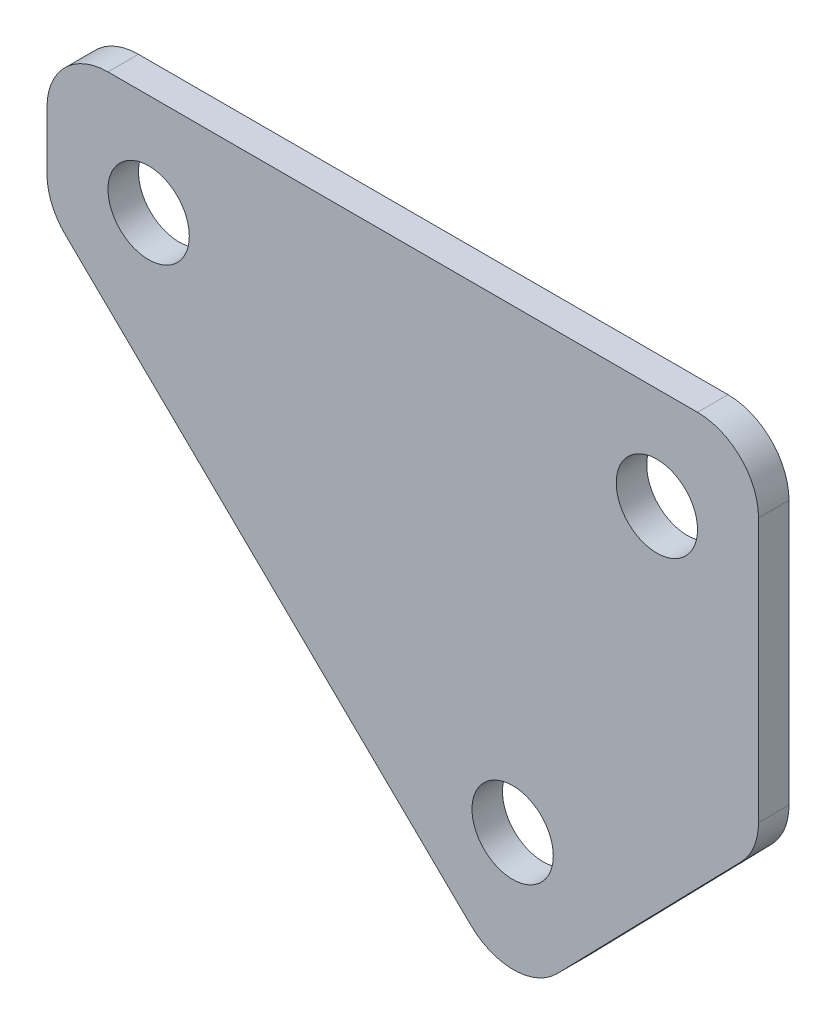
ISO-10303-21;
HEADER;
FILE_DESCRIPTION(('STEP AP214'),'2;1');
FILE_NAME('part.step','',(''),(''),'','','');
FILE_SCHEMA(('AUTOMOTIVE_DESIGN { 1 0 10303 214 1 1 1 1 }'));
ENDSEC;
DATA;
#1=APPLICATION_CONTEXT('core data for automotive mechanical design processes');
#2=APPLICATION_PROTOCOL_DEFINITION('international standard','automotive_design',2000,#1);
#3=PRODUCT_CONTEXT('',#1,'mechanical');
#4=PRODUCT('Part','Part','',(#3));
#5=PRODUCT_RELATED_PRODUCT_CATEGORY('part','',(#4));
#6=PRODUCT_DEFINITION_FORMATION('','',#4);
#7=PRODUCT_DEFINITION_CONTEXT('part definition',#1,'design');
#8=PRODUCT_DEFINITION('design','',#6,#7);
#9=PRODUCT_DEFINITION_SHAPE('','',#8);
#10=(LENGTH_UNIT() NAMED_UNIT(*) SI_UNIT(.MILLI.,.METRE.));
#11=(NAMED_UNIT(*) PLANE_ANGLE_UNIT() SI_UNIT($,.RADIAN.));
#12=(NAMED_UNIT(*) SI_UNIT($,.STERADIAN.) SOLID_ANGLE_UNIT());
#13=UNCERTAINTY_MEASURE_WITH_UNIT(LENGTH_MEASURE(1.E-05),#10,'distance_accuracy_value','');
#14=(GEOMETRIC_REPRESENTATION_CONTEXT(3) GLOBAL_UNCERTAINTY_ASSIGNED_CONTEXT((#13)) GLOBAL_UNIT_ASSIGNED_CONTEXT((#10,
#11,#12)) REPRESENTATION_CONTEXT('',''));
#15=CARTESIAN_POINT('',(0.,0.,0.));
#16=DIRECTION('',(0.,0.,1.));
#17=DIRECTION('',(1.,0.,0.));
#18=AXIS2_PLACEMENT_3D('',#15,#16,#17);
#19=CARTESIAN_POINT('',(-4.70018897091451,-4.82319446412929,1.5));
#20=DIRECTION('',(0.697915467486602,0.716180145105237,0.));
#21=DIRECTION('',(-0.716180145105237,0.697915467486602,0.));
#22=AXIS2_PLACEMENT_3D('',#19,#20,#21);
#23=PLANE('',#22);
#24=DIRECTION('',(0.716180145105237,-0.697915467486602,0.));
#25=VECTOR('',#24,1.);
#26=CARTESIAN_POINT('',(-4.70018897091451,-4.82319446412929,0.));
#27=LINE('',#26,#25);
#28=CARTESIAN_POINT('',(-16.5937464024598,6.76704264541242,0.));
#29=VERTEX_POINT('',#28);
#30=CARTESIAN_POINT('',(3.34728658040838,-12.6654359726023,0.));
#31=VERTEX_POINT('',#30);
#32=EDGE_CURVE('E187',#29,#31,#27,.T.);
#33=ORIENTED_EDGE('',*,*,#32,.T.);
#34=DIRECTION('',(0.,0.,-1.));
#35=VECTOR('',#34,1.);
#36=CARTESIAN_POINT('',(3.34728658040838,-12.6654359726023,1.5));
#37=LINE('',#36,#35);
#38=CARTESIAN_POINT('',(3.34728658040838,-12.6654359726023,1.5));
#39=VERTEX_POINT('',#38);
#40=EDGE_CURVE('E172',#31,#39,#37,.F.);
#41=ORIENTED_EDGE('',*,*,#40,.T.);
#42=DIRECTION('',(0.716180145105237,-0.697915467486602,0.));
#43=VECTOR('',#42,1.);
#44=CARTESIAN_POINT('',(-4.70018897091451,-4.82319446412929,1.5));
#45=LINE('',#44,#43);
#46=CARTESIAN_POINT('',(-16.5937464024598,6.76704264541242,1.5));
#47=VERTEX_POINT('',#46);
#48=EDGE_CURVE('E203',#47,#39,#45,.T.);
#49=ORIENTED_EDGE('',*,*,#48,.F.);
#50=DIRECTION('',(0.,0.,-1.));
#51=VECTOR('',#50,1.);
#52=CARTESIAN_POINT('',(-16.5937464024598,6.76704264541242,0.));
#53=LINE('',#52,#51);
#54=EDGE_CURVE('E169',#47,#29,#53,.T.);
#55=ORIENTED_EDGE('',*,*,#54,.T.);
#56=EDGE_LOOP('',(#33,#41,#49,#55));
#57=FACE_BOUND('',#56,.T.);
#58=ADVANCED_FACE('F35',(#57),#23,.F.);
#59=CARTESIAN_POINT('',(10.1960159866386,-9.93598791093283,1.5));
#60=DIRECTION('',(-0.716180145105237,0.697915467486602,0.));
#61=DIRECTION('',(-0.697915467486602,-0.716180145105237,0.));
#62=AXIS2_PLACEMENT_3D('',#59,#60,#61);
#63=PLANE('',#62);
#64=DIRECTION('',(0.697915467486602,0.716180145105237,0.));
#65=VECTOR('',#64,1.);
#66=CARTESIAN_POINT('',(10.1960159866386,-9.93598791093283,0.));
#67=LINE('',#66,#65);
#68=CARTESIAN_POINT('',(7.5895734181839,-12.6106419397464,0.));
#69=VERTEX_POINT('',#68);
#70=CARTESIAN_POINT('',(16.6485404353157,-3.31459877251632,0.));
#71=VERTEX_POINT('',#70);
#72=EDGE_CURVE('E190',#69,#71,#67,.T.);
#73=ORIENTED_EDGE('',*,*,#72,.T.);
#74=DIRECTION('',(0.,0.,-1.));
#75=VECTOR('',#74,1.);
#76=CARTESIAN_POINT('',(16.6485404353157,-3.31459877251632,1.5));
#77=LINE('',#76,#75);
#78=CARTESIAN_POINT('',(16.6485404353157,-3.31459877251632,1.5));
#79=VERTEX_POINT('',#78);
#80=EDGE_CURVE('E167',#71,#79,#77,.F.);
#81=ORIENTED_EDGE('',*,*,#80,.T.);
#82=DIRECTION('',(0.697915467486602,0.716180145105237,0.));
#83=VECTOR('',#82,1.);
#84=CARTESIAN_POINT('',(10.1960159866386,-9.93598791093283,1.5));
#85=LINE('',#84,#83);
#86=CARTESIAN_POINT('',(7.5895734181839,-12.6106419397464,1.5));
#87=VERTEX_POINT('',#86);
#88=EDGE_CURVE('E208',#87,#79,#85,.T.);
#89=ORIENTED_EDGE('',*,*,#88,.F.);
#90=DIRECTION('',(0.,0.,-1.));
#91=VECTOR('',#90,1.);
#92=CARTESIAN_POINT('',(7.5895734181839,-12.6106419397464,1.5));
#93=LINE('',#92,#91);
#94=EDGE_CURVE('E164',#87,#69,#93,.T.);
#95=ORIENTED_EDGE('',*,*,#94,.T.);
#96=EDGE_LOOP('',(#73,#81,#89,#95));
#97=FACE_BOUND('',#96,.T.);
#98=ADVANCED_FACE('F230',(#97),#63,.F.);
#99=CARTESIAN_POINT('',(17.5,0.,1.5));
#100=DIRECTION('',(-1.,0.,0.));
#101=DIRECTION('',(0.,0.,1.));
#102=AXIS2_PLACEMENT_3D('',#99,#100,#101);
#103=PLANE('',#102);
#104=DIRECTION('',(0.,1.,0.));
#105=VECTOR('',#104,1.);
#106=CARTESIAN_POINT('',(17.5,0.,0.));
#107=LINE('',#106,#105);
#108=CARTESIAN_POINT('',(17.5,-1.22085237005652,0.));
#109=VERTEX_POINT('',#108);
#110=CARTESIAN_POINT('',(17.5,11.7591823750621,0.));
#111=VERTEX_POINT('',#110);
#112=EDGE_CURVE('E131',#109,#111,#107,.T.);
#113=ORIENTED_EDGE('',*,*,#112,.T.);
#114=DIRECTION('',(0.,0.,-1.));
#115=VECTOR('',#114,1.);
#116=CARTESIAN_POINT('',(17.5,11.7591823750621,1.5));
#117=LINE('',#116,#115);
#118=CARTESIAN_POINT('',(17.5,11.7591823750621,1.5));
#119=VERTEX_POINT('',#118);
#120=EDGE_CURVE('E153',#111,#119,#117,.F.);
#121=ORIENTED_EDGE('',*,*,#120,.T.);
#122=DIRECTION('',(0.,1.,0.));
#123=VECTOR('',#122,1.);
#124=CARTESIAN_POINT('',(17.5,0.,1.5));
#125=LINE('',#124,#123);
#126=CARTESIAN_POINT('',(17.5,-1.22085237005652,1.5));
#127=VERTEX_POINT('',#126);
#128=EDGE_CURVE('E180',#127,#119,#125,.T.);
#129=ORIENTED_EDGE('',*,*,#128,.F.);
#130=DIRECTION('',(0.,0.,-1.));
#131=VECTOR('',#130,1.);
#132=CARTESIAN_POINT('',(17.5,-1.22085237005652,1.5));
#133=LINE('',#132,#131);
#134=EDGE_CURVE('E150',#127,#109,#133,.T.);
#135=ORIENTED_EDGE('',*,*,#134,.T.);
#136=EDGE_LOOP('',(#113,#121,#129,#135));
#137=FACE_BOUND('',#136,.T.);
#138=ADVANCED_FACE('F224',(#137),#103,.F.);
#139=CARTESIAN_POINT('',(0.,14.7591823750621,1.5));
#140=DIRECTION('',(0.,1.,0.));
#141=DIRECTION('',(-1.,0.,0.));
#142=AXIS2_PLACEMENT_3D('',#139,#140,#141);
#143=PLANE('',#142);
#144=DIRECTION('',(1.,0.,0.));
#145=VECTOR('',#144,1.);
#146=CARTESIAN_POINT('',(0.,14.7591823750621,1.5));
#147=LINE('',#146,#145);
#148=CARTESIAN_POINT('',(-14.5,14.7591823750621,1.5));
#149=VERTEX_POINT('',#148);
#150=CARTESIAN_POINT('',(14.5,14.7591823750621,1.5));
#151=VERTEX_POINT('',#150);
#152=EDGE_CURVE('E176',#149,#151,#147,.T.);
#153=ORIENTED_EDGE('',*,*,#152,.T.);
#154=DIRECTION('',(0.,0.,-1.));
#155=VECTOR('',#154,1.);
#156=CARTESIAN_POINT('',(14.5,14.7591823750621,0.));
#157=LINE('',#156,#155);
#158=CARTESIAN_POINT('',(14.5,14.7591823750621,0.));
#159=VERTEX_POINT('',#158);
#160=EDGE_CURVE('E123',#151,#159,#157,.T.);
#161=ORIENTED_EDGE('',*,*,#160,.T.);
#162=DIRECTION('',(1.,0.,0.));
#163=VECTOR('',#162,1.);
#164=CARTESIAN_POINT('',(0.,14.7591823750621,0.));
#165=LINE('',#164,#163);
#166=CARTESIAN_POINT('',(-14.5,14.7591823750621,0.));
#167=VERTEX_POINT('',#166);
#168=EDGE_CURVE('E116',#167,#159,#165,.T.);
#169=ORIENTED_EDGE('',*,*,#168,.F.);
#170=DIRECTION('',(0.,0.,-1.));
#171=VECTOR('',#170,1.);
#172=CARTESIAN_POINT('',(-14.5,14.7591823750621,1.5));
#173=LINE('',#172,#171);
#174=EDGE_CURVE('E129',#167,#149,#173,.F.);
#175=ORIENTED_EDGE('',*,*,#174,.T.);
#176=EDGE_LOOP('',(#153,#161,#169,#175));
#177=FACE_BOUND('',#176,.T.);
#178=ADVANCED_FACE('F128',(#177),#143,.T.);
#179=CARTESIAN_POINT('',(-12.5,9.75918237506212,1.5));
#180=DIRECTION('',(0.,0.,-1.));
#181=DIRECTION('',(-1.,0.,0.));
#182=AXIS2_PLACEMENT_3D('',#179,#180,#181);
#183=CYLINDRICAL_SURFACE('',#182,2.);
#184=CARTESIAN_POINT('',(-12.5,9.75918237506212,1.5));
#185=DIRECTION('',(0.,0.,1.));
#186=DIRECTION('',(1.,0.,0.));
#187=AXIS2_PLACEMENT_3D('',#184,#185,#186);
#188=CIRCLE('',#187,2.);
#189=CARTESIAN_POINT('',(-10.5,9.75918237506212,1.5));
#190=VERTEX_POINT('',#189);
#191=EDGE_CURVE('E137',#190,#190,#188,.T.);
#192=ORIENTED_EDGE('',*,*,#191,.T.);
#193=EDGE_LOOP('',(#192));
#194=FACE_BOUND('',#193,.T.);
#195=CARTESIAN_POINT('',(-12.5,9.75918237506212,0.));
#196=DIRECTION('',(0.,0.,1.));
#197=DIRECTION('',(1.,0.,0.));
#198=AXIS2_PLACEMENT_3D('',#195,#196,#197);
#199=CIRCLE('',#198,2.);
#200=CARTESIAN_POINT('',(-10.5,9.75918237506212,0.));
#201=VERTEX_POINT('',#200);
#202=EDGE_CURVE('E195',#201,#201,#199,.T.);
#203=ORIENTED_EDGE('',*,*,#202,.F.);
#204=EDGE_LOOP('',(#203));
#205=FACE_BOUND('',#204,.T.);
#206=ADVANCED_FACE('F328',(#194,#205),#183,.F.);
#207=CARTESIAN_POINT('',(-17.5,0.,1.5));
#208=DIRECTION('',(-1.,0.,0.));
#209=DIRECTION('',(0.,0.,1.));
#210=AXIS2_PLACEMENT_3D('',#207,#208,#209);
#211=PLANE('',#210);
#212=DIRECTION('',(0.,1.,0.));
#213=VECTOR('',#212,1.);
#214=CARTESIAN_POINT('',(-17.5,0.,0.));
#215=LINE('',#214,#213);
#216=CARTESIAN_POINT('',(-17.5,8.91558308072813,0.));
#217=VERTEX_POINT('',#216);
#218=CARTESIAN_POINT('',(-17.5,11.7591823750621,0.));
#219=VERTEX_POINT('',#218);
#220=EDGE_CURVE('E117',#217,#219,#215,.T.);
#221=ORIENTED_EDGE('',*,*,#220,.F.);
#222=DIRECTION('',(0.,0.,-1.));
#223=VECTOR('',#222,1.);
#224=CARTESIAN_POINT('',(-17.5,8.91558308072813,1.5));
#225=LINE('',#224,#223);
#226=CARTESIAN_POINT('',(-17.5,8.91558308072813,1.5));
#227=VERTEX_POINT('',#226);
#228=EDGE_CURVE('E11',#217,#227,#225,.F.);
#229=ORIENTED_EDGE('',*,*,#228,.T.);
#230=DIRECTION('',(0.,1.,0.));
#231=VECTOR('',#230,1.);
#232=CARTESIAN_POINT('',(-17.5,0.,1.5));
#233=LINE('',#232,#231);
#234=CARTESIAN_POINT('',(-17.5,11.7591823750621,1.5));
#235=VERTEX_POINT('',#234);
#236=EDGE_CURVE('E174',#227,#235,#233,.T.);
#237=ORIENTED_EDGE('',*,*,#236,.T.);
#238=DIRECTION('',(0.,0.,-1.));
#239=VECTOR('',#238,1.);
#240=CARTESIAN_POINT('',(-17.5,11.7591823750621,1.5));
#241=LINE('',#240,#239);
#242=EDGE_CURVE('E43',#235,#219,#241,.T.);
#243=ORIENTED_EDGE('',*,*,#242,.T.);
#244=EDGE_LOOP('',(#221,#229,#237,#243));
#245=FACE_BOUND('',#244,.T.);
#246=ADVANCED_FACE('F173',(#245),#211,.T.);
#247=CARTESIAN_POINT('',(5.40450362763092,-7.68870431210293,1.5));
#248=DIRECTION('',(0.,0.,-1.));
#249=DIRECTION('',(-1.,0.,0.));
#250=AXIS2_PLACEMENT_3D('',#247,#248,#249);
#251=CYLINDRICAL_SURFACE('',#250,2.);
#252=CARTESIAN_POINT('',(5.40450362763092,-7.68870431210293,1.5));
#253=DIRECTION('',(0.,0.,1.));
#254=DIRECTION('',(1.,0.,0.));
#255=AXIS2_PLACEMENT_3D('',#252,#253,#254);
#256=CIRCLE('',#255,2.);
#257=CARTESIAN_POINT('',(7.40450362763092,-7.68870431210293,1.5));
#258=VERTEX_POINT('',#257);
#259=EDGE_CURVE('E199',#258,#258,#256,.T.);
#260=ORIENTED_EDGE('',*,*,#259,.T.);
#261=EDGE_LOOP('',(#260));
#262=FACE_BOUND('',#261,.T.);
#263=CARTESIAN_POINT('',(5.40450362763092,-7.68870431210293,0.));
#264=DIRECTION('',(0.,0.,1.));
#265=DIRECTION('',(1.,0.,0.));
#266=AXIS2_PLACEMENT_3D('',#263,#264,#265);
#267=CIRCLE('',#266,2.);
#268=CARTESIAN_POINT('',(7.40450362763092,-7.68870431210293,0.));
#269=VERTEX_POINT('',#268);
#270=EDGE_CURVE('E184',#269,#269,#267,.T.);
#271=ORIENTED_EDGE('',*,*,#270,.F.);
#272=EDGE_LOOP('',(#271));
#273=FACE_BOUND('',#272,.T.);
#274=ADVANCED_FACE('F257',(#262,#273),#251,.F.);
#275=CARTESIAN_POINT('',(12.5,9.75918237506212,1.5));
#276=DIRECTION('',(0.,0.,-1.));
#277=DIRECTION('',(-1.,0.,0.));
#278=AXIS2_PLACEMENT_3D('',#275,#276,#277);
#279=CYLINDRICAL_SURFACE('',#278,2.);
#280=CARTESIAN_POINT('',(12.5,9.75918237506212,1.5));
#281=DIRECTION('',(0.,0.,1.));
#282=DIRECTION('',(1.,0.,0.));
#283=AXIS2_PLACEMENT_3D('',#280,#281,#282);
#284=CIRCLE('',#283,2.);
#285=CARTESIAN_POINT('',(14.5,9.75918237506212,1.5));
#286=VERTEX_POINT('',#285);
#287=EDGE_CURVE('E133',#286,#286,#284,.F.);
#288=ORIENTED_EDGE('',*,*,#287,.F.);
#289=EDGE_LOOP('',(#288));
#290=FACE_BOUND('',#289,.T.);
#291=CARTESIAN_POINT('',(12.5,9.75918237506212,0.));
#292=DIRECTION('',(0.,0.,1.));
#293=DIRECTION('',(1.,0.,0.));
#294=AXIS2_PLACEMENT_3D('',#291,#292,#293);
#295=CIRCLE('',#294,2.);
#296=CARTESIAN_POINT('',(14.5,9.75918237506212,0.));
#297=VERTEX_POINT('',#296);
#298=EDGE_CURVE('E140',#297,#297,#295,.F.);
#299=ORIENTED_EDGE('',*,*,#298,.T.);
#300=EDGE_LOOP('',(#299));
#301=FACE_BOUND('',#300,.T.);
#302=ADVANCED_FACE('F260',(#290,#301),#279,.F.);
#303=CARTESIAN_POINT('',(0.,0.,1.5));
#304=DIRECTION('',(0.,0.,1.));
#305=DIRECTION('',(1.,0.,0.));
#306=AXIS2_PLACEMENT_3D('',#303,#304,#305);
#307=PLANE('',#306);
#308=ORIENTED_EDGE('',*,*,#259,.F.);
#309=EDGE_LOOP('',(#308));
#310=FACE_BOUND('',#309,.T.);
#311=ORIENTED_EDGE('',*,*,#128,.T.);
#312=CARTESIAN_POINT('',(14.5,11.7591823750621,1.5));
#313=DIRECTION('',(0.,0.,1.));
#314=DIRECTION('',(1.,0.,0.));
#315=AXIS2_PLACEMENT_3D('',#312,#313,#314);
#316=CIRCLE('',#315,3.);
#317=EDGE_CURVE('E162',#119,#151,#316,.T.);
#318=ORIENTED_EDGE('',*,*,#317,.T.);
#319=ORIENTED_EDGE('',*,*,#152,.F.);
#320=CARTESIAN_POINT('',(-14.5,11.7591823750621,1.5));
#321=DIRECTION('',(0.,0.,1.));
#322=DIRECTION('',(1.,0.,0.));
#323=AXIS2_PLACEMENT_3D('',#320,#321,#322);
#324=CIRCLE('',#323,3.);
#325=EDGE_CURVE('E50',#149,#235,#324,.T.);
#326=ORIENTED_EDGE('',*,*,#325,.T.);
#327=ORIENTED_EDGE('',*,*,#236,.F.);
#328=CARTESIAN_POINT('',(-14.5,8.91558308072813,1.5));
#329=DIRECTION('',(0.,0.,1.));
#330=DIRECTION('',(1.,0.,0.));
#331=AXIS2_PLACEMENT_3D('',#328,#329,#330);
#332=CIRCLE('',#331,3.);
#333=EDGE_CURVE('E156',#227,#47,#332,.T.);
#334=ORIENTED_EDGE('',*,*,#333,.T.);
#335=ORIENTED_EDGE('',*,*,#48,.T.);
#336=CARTESIAN_POINT('',(5.44103298286819,-10.5168955372866,1.5));
#337=DIRECTION('',(0.,0.,1.));
#338=DIRECTION('',(1.,0.,0.));
#339=AXIS2_PLACEMENT_3D('',#336,#337,#338);
#340=CIRCLE('',#339,3.);
#341=EDGE_CURVE('E158',#39,#87,#340,.T.);
#342=ORIENTED_EDGE('',*,*,#341,.T.);
#343=ORIENTED_EDGE('',*,*,#88,.T.);
#344=CARTESIAN_POINT('',(14.5,-1.22085237005652,1.5));
#345=DIRECTION('',(0.,0.,1.));
#346=DIRECTION('',(1.,0.,0.));
#347=AXIS2_PLACEMENT_3D('',#344,#345,#346);
#348=CIRCLE('',#347,3.);
#349=EDGE_CURVE('E160',#79,#127,#348,.T.);
#350=ORIENTED_EDGE('',*,*,#349,.T.);
#351=EDGE_LOOP('',(#311,#318,#319,#326,#327,#334,#335,#342,#343,#350));
#352=FACE_BOUND('',#351,.T.);
#353=ORIENTED_EDGE('',*,*,#191,.F.);
#354=EDGE_LOOP('',(#353));
#355=FACE_BOUND('',#354,.T.);
#356=ORIENTED_EDGE('',*,*,#287,.T.);
#357=EDGE_LOOP('',(#356));
#358=FACE_BOUND('',#357,.T.);
#359=ADVANCED_FACE('F215',(#310,#352,#355,#358),#307,.T.);
#360=CARTESIAN_POINT('',(0.,0.,0.));
#361=DIRECTION('',(0.,0.,1.));
#362=DIRECTION('',(1.,0.,0.));
#363=AXIS2_PLACEMENT_3D('',#360,#361,#362);
#364=PLANE('',#363);
#365=ORIENTED_EDGE('',*,*,#270,.T.);
#366=EDGE_LOOP('',(#365));
#367=FACE_BOUND('',#366,.T.);
#368=ORIENTED_EDGE('',*,*,#168,.T.);
#369=CARTESIAN_POINT('',(14.5,11.7591823750621,0.));
#370=DIRECTION('',(0.,0.,1.));
#371=DIRECTION('',(1.,0.,0.));
#372=AXIS2_PLACEMENT_3D('',#369,#370,#371);
#373=CIRCLE('',#372,3.);
#374=EDGE_CURVE('E148',#159,#111,#373,.F.);
#375=ORIENTED_EDGE('',*,*,#374,.T.);
#376=ORIENTED_EDGE('',*,*,#112,.F.);
#377=CARTESIAN_POINT('',(14.5,-1.22085237005652,0.));
#378=DIRECTION('',(0.,0.,1.));
#379=DIRECTION('',(1.,0.,0.));
#380=AXIS2_PLACEMENT_3D('',#377,#378,#379);
#381=CIRCLE('',#380,3.);
#382=EDGE_CURVE('E146',#109,#71,#381,.F.);
#383=ORIENTED_EDGE('',*,*,#382,.T.);
#384=ORIENTED_EDGE('',*,*,#72,.F.);
#385=CARTESIAN_POINT('',(5.44103298286819,-10.5168955372866,0.));
#386=DIRECTION('',(0.,0.,1.));
#387=DIRECTION('',(1.,0.,0.));
#388=AXIS2_PLACEMENT_3D('',#385,#386,#387);
#389=CIRCLE('',#388,3.);
#390=EDGE_CURVE('E144',#69,#31,#389,.F.);
#391=ORIENTED_EDGE('',*,*,#390,.T.);
#392=ORIENTED_EDGE('',*,*,#32,.F.);
#393=CARTESIAN_POINT('',(-14.5,8.91558308072813,0.));
#394=DIRECTION('',(0.,0.,1.));
#395=DIRECTION('',(1.,0.,0.));
#396=AXIS2_PLACEMENT_3D('',#393,#394,#395);
#397=CIRCLE('',#396,3.);
#398=EDGE_CURVE('E122',#29,#217,#397,.F.);
#399=ORIENTED_EDGE('',*,*,#398,.T.);
#400=ORIENTED_EDGE('',*,*,#220,.T.);
#401=CARTESIAN_POINT('',(-14.5,11.7591823750621,0.));
#402=DIRECTION('',(0.,0.,1.));
#403=DIRECTION('',(1.,0.,0.));
#404=AXIS2_PLACEMENT_3D('',#401,#402,#403);
#405=CIRCLE('',#404,3.);
#406=EDGE_CURVE('E112',#219,#167,#405,.F.);
#407=ORIENTED_EDGE('',*,*,#406,.T.);
#408=EDGE_LOOP('',(#368,#375,#376,#383,#384,#391,#392,#399,#400,#407));
#409=FACE_BOUND('',#408,.T.);
#410=ORIENTED_EDGE('',*,*,#202,.T.);
#411=EDGE_LOOP('',(#410));
#412=FACE_BOUND('',#411,.T.);
#413=ORIENTED_EDGE('',*,*,#298,.F.);
#414=EDGE_LOOP('',(#413));
#415=FACE_BOUND('',#414,.T.);
#416=ADVANCED_FACE('F114',(#367,#409,#412,#415),#364,.F.);
#417=CARTESIAN_POINT('',(14.5,11.7591823750621,1.5));
#418=DIRECTION('',(0.,0.,1.));
#419=DIRECTION('',(1.,0.,0.));
#420=AXIS2_PLACEMENT_3D('',#417,#418,#419);
#421=CYLINDRICAL_SURFACE('',#420,3.);
#422=ORIENTED_EDGE('',*,*,#317,.F.);
#423=ORIENTED_EDGE('',*,*,#120,.F.);
#424=ORIENTED_EDGE('',*,*,#374,.F.);
#425=ORIENTED_EDGE('',*,*,#160,.F.);
#426=EDGE_LOOP('',(#422,#423,#424,#425));
#427=FACE_BOUND('',#426,.T.);
#428=ADVANCED_FACE('F222',(#427),#421,.T.);
#429=CARTESIAN_POINT('',(14.5,-1.22085237005652,1.5));
#430=DIRECTION('',(0.,0.,-1.));
#431=DIRECTION('',(-1.,0.,0.));
#432=AXIS2_PLACEMENT_3D('',#429,#430,#431);
#433=CYLINDRICAL_SURFACE('',#432,3.);
#434=ORIENTED_EDGE('',*,*,#349,.F.);
#435=ORIENTED_EDGE('',*,*,#80,.F.);
#436=ORIENTED_EDGE('',*,*,#382,.F.);
#437=ORIENTED_EDGE('',*,*,#134,.F.);
#438=EDGE_LOOP('',(#434,#435,#436,#437));
#439=FACE_BOUND('',#438,.T.);
#440=ADVANCED_FACE('F226',(#439),#433,.T.);
#441=CARTESIAN_POINT('',(5.44103298286819,-10.5168955372866,1.5));
#442=DIRECTION('',(0.,0.,-1.));
#443=DIRECTION('',(-1.,0.,0.));
#444=AXIS2_PLACEMENT_3D('',#441,#442,#443);
#445=CYLINDRICAL_SURFACE('',#444,3.);
#446=ORIENTED_EDGE('',*,*,#341,.F.);
#447=ORIENTED_EDGE('',*,*,#40,.F.);
#448=ORIENTED_EDGE('',*,*,#390,.F.);
#449=ORIENTED_EDGE('',*,*,#94,.F.);
#450=EDGE_LOOP('',(#446,#447,#448,#449));
#451=FACE_BOUND('',#450,.T.);
#452=ADVANCED_FACE('F235',(#451),#445,.T.);
#453=CARTESIAN_POINT('',(-14.5,8.91558308072813,1.5));
#454=DIRECTION('',(0.,0.,1.));
#455=DIRECTION('',(1.,0.,0.));
#456=AXIS2_PLACEMENT_3D('',#453,#454,#455);
#457=CYLINDRICAL_SURFACE('',#456,3.);
#458=ORIENTED_EDGE('',*,*,#333,.F.);
#459=ORIENTED_EDGE('',*,*,#228,.F.);
#460=ORIENTED_EDGE('',*,*,#398,.F.);
#461=ORIENTED_EDGE('',*,*,#54,.F.);
#462=EDGE_LOOP('',(#458,#459,#460,#461));
#463=FACE_BOUND('',#462,.T.);
#464=ADVANCED_FACE('F242',(#463),#457,.T.);
#465=CARTESIAN_POINT('',(-14.5,11.7591823750621,1.5));
#466=DIRECTION('',(0.,0.,-1.));
#467=DIRECTION('',(-1.,0.,0.));
#468=AXIS2_PLACEMENT_3D('',#465,#466,#467);
#469=CYLINDRICAL_SURFACE('',#468,3.);
#470=ORIENTED_EDGE('',*,*,#325,.F.);
#471=ORIENTED_EDGE('',*,*,#174,.F.);
#472=ORIENTED_EDGE('',*,*,#406,.F.);
#473=ORIENTED_EDGE('',*,*,#242,.F.);
#474=EDGE_LOOP('',(#470,#471,#472,#473));
#475=FACE_BOUND('',#474,.T.);
#476=ADVANCED_FACE('F37',(#475),#469,.T.);
#477=CLOSED_SHELL('',(#58,#98,#138,#178,#206,#246,#274,#302,#359,#416,#428,#440,#452,#464,#476));
#478=MANIFOLD_SOLID_BREP('B2',#477);
#479=ADVANCED_BREP_SHAPE_REPRESENTATION('',(#18,#478),#14);
#480=SHAPE_DEFINITION_REPRESENTATION(#9,#479);
ENDSEC;
END-ISO-10303-21;
